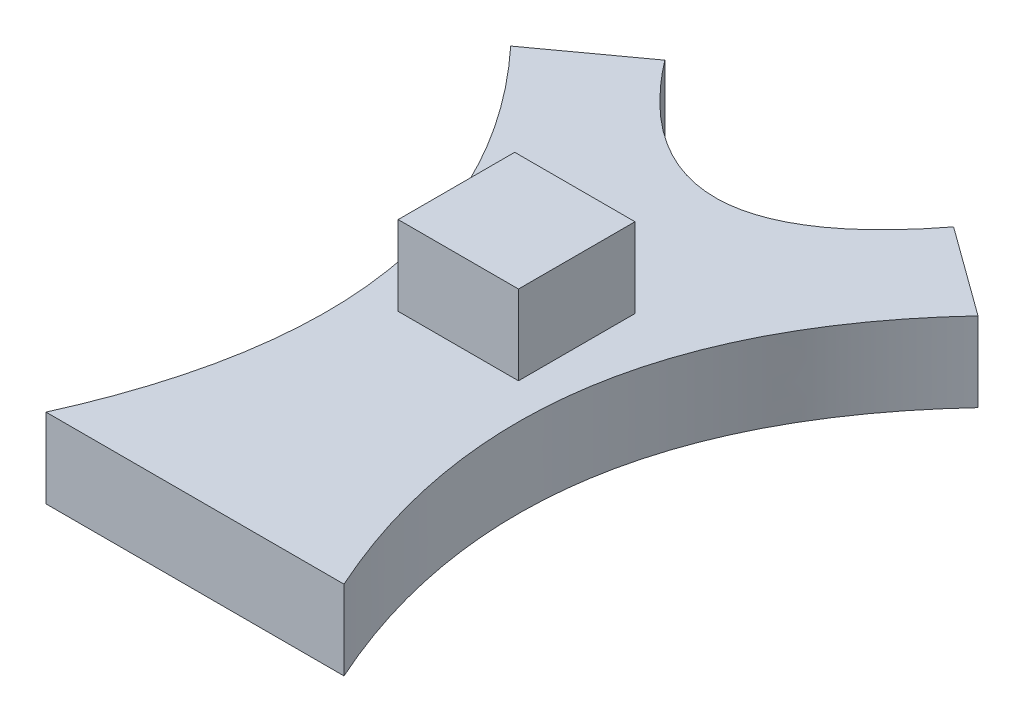
ISO-10303-21;
HEADER;
FILE_DESCRIPTION(('STEP AP214'),'2;1');
FILE_NAME('part.step','',(''),(''),'','','');
FILE_SCHEMA(('AUTOMOTIVE_DESIGN { 1 0 10303 214 1 1 1 1 }'));
ENDSEC;
DATA;
#1=APPLICATION_CONTEXT('core data for automotive mechanical design processes');
#2=APPLICATION_PROTOCOL_DEFINITION('international standard','automotive_design',2000,#1);
#3=PRODUCT_CONTEXT('',#1,'mechanical');
#4=PRODUCT('Part','Part','',(#3));
#5=PRODUCT_RELATED_PRODUCT_CATEGORY('part','',(#4));
#6=PRODUCT_DEFINITION_FORMATION('','',#4);
#7=PRODUCT_DEFINITION_CONTEXT('part definition',#1,'design');
#8=PRODUCT_DEFINITION('design','',#6,#7);
#9=PRODUCT_DEFINITION_SHAPE('','',#8);
#10=(LENGTH_UNIT() NAMED_UNIT(*) SI_UNIT(.MILLI.,.METRE.));
#11=(NAMED_UNIT(*) PLANE_ANGLE_UNIT() SI_UNIT($,.RADIAN.));
#12=(NAMED_UNIT(*) SI_UNIT($,.STERADIAN.) SOLID_ANGLE_UNIT());
#13=UNCERTAINTY_MEASURE_WITH_UNIT(LENGTH_MEASURE(1.E-05),#10,'distance_accuracy_value','');
#14=(GEOMETRIC_REPRESENTATION_CONTEXT(3) GLOBAL_UNCERTAINTY_ASSIGNED_CONTEXT((#13)) GLOBAL_UNIT_ASSIGNED_CONTEXT((#10,
#11,#12)) REPRESENTATION_CONTEXT('',''));
#15=CARTESIAN_POINT('',(0.,0.,0.));
#16=DIRECTION('',(0.,0.,1.));
#17=DIRECTION('',(1.,0.,0.));
#18=AXIS2_PLACEMENT_3D('',#15,#16,#17);
#19=CARTESIAN_POINT('',(-12.6464337295414,10.,3.71814293841253));
#20=DIRECTION('',(0.,1.,0.));
#21=DIRECTION('',(0.,0.,1.));
#22=AXIS2_PLACEMENT_3D('',#19,#20,#21);
#23=PLANE('',#22);
#24=CARTESIAN_POINT('',(-29.3892626146229,10.,-28.6474508437584));
#25=CARTESIAN_POINT('',(-1.22770400923834,10.,1.53458643933057));
#26=CARTESIAN_POINT('',(-18.7410642850661,10.,40.4508497187474));
#27=B_SPLINE_CURVE_WITH_KNOTS('',2,(#24,#25,#26),.UNSPECIFIED.,.F.,.F.,(3,3),(0.,1.),.UNSPECIFIED.);
#28=CARTESIAN_POINT('',(-29.3892626146229,10.,-28.6474508437584));
#29=VERTEX_POINT('',#28);
#30=CARTESIAN_POINT('',(-18.7410642850661,10.,40.4508497187477));
#31=VERTEX_POINT('',#30);
#32=EDGE_CURVE('E157',#29,#31,#27,.T.);
#33=ORIENTED_EDGE('',*,*,#32,.T.);
#34=DIRECTION('',(1.,0.,0.));
#35=VECTOR('',#34,1.);
#36=CARTESIAN_POINT('',(-18.7410642850661,10.,40.4508497187477));
#37=LINE('',#36,#35);
#38=CARTESIAN_POINT('',(18.7410642850661,10.,40.4508497187474));
#39=VERTEX_POINT('',#38);
#40=EDGE_CURVE('E94',#31,#39,#37,.T.);
#41=ORIENTED_EDGE('',*,*,#40,.T.);
#42=CARTESIAN_POINT('',(18.7410642850661,10.,40.4508497187474));
#43=CARTESIAN_POINT('',(1.22770400923834,10.,1.53458643933057));
#44=CARTESIAN_POINT('',(29.3892626146229,10.,-28.6474508437584));
#45=B_SPLINE_CURVE_WITH_KNOTS('',2,(#42,#43,#44),.UNSPECIFIED.,.F.,.F.,(3,3),(0.,1.),.UNSPECIFIED.);
#46=CARTESIAN_POINT('',(29.3892626146235,10.,-28.6474508437578));
#47=VERTEX_POINT('',#46);
#48=EDGE_CURVE('E111',#39,#47,#45,.T.);
#49=ORIENTED_EDGE('',*,*,#48,.T.);
#50=DIRECTION('',(-0.809016994374941,0.,-0.587785252292482));
#51=VECTOR('',#50,1.);
#52=CARTESIAN_POINT('',(18.1635632001347,10.,-36.803398874989));
#53=LINE('',#52,#51);
#54=CARTESIAN_POINT('',(18.1635632001347,10.,-36.803398874989));
#55=VERTEX_POINT('',#54);
#56=EDGE_CURVE('E104',#47,#55,#53,.T.);
#57=ORIENTED_EDGE('',*,*,#56,.T.);
#58=CARTESIAN_POINT('',(18.1635632001347,10.,-36.803398874989));
#59=CARTESIAN_POINT('',(0.,10.,-13.196601125011));
#60=CARTESIAN_POINT('',(-18.1635632001347,10.,-36.803398874989));
#61=B_SPLINE_CURVE_WITH_KNOTS('',2,(#58,#59,#60),.UNSPECIFIED.,.F.,.F.,(3,3),(0.,1.),.UNSPECIFIED.);
#62=CARTESIAN_POINT('',(-18.1635632001347,10.,-36.803398874989));
#63=VERTEX_POINT('',#62);
#64=EDGE_CURVE('E108',#55,#63,#61,.T.);
#65=ORIENTED_EDGE('',*,*,#64,.T.);
#66=DIRECTION('',(-0.809016994374947,0.,0.587785252292473));
#67=VECTOR('',#66,1.);
#68=CARTESIAN_POINT('',(-29.3892626146229,10.,-28.6474508437584));
#69=LINE('',#68,#67);
#70=EDGE_CURVE('E59',#63,#29,#69,.T.);
#71=ORIENTED_EDGE('',*,*,#70,.T.);
#72=EDGE_LOOP('',(#33,#41,#49,#57,#65,#71));
#73=FACE_BOUND('',#72,.T.);
#74=DIRECTION('',(-1.,0.,0.));
#75=VECTOR('',#74,1.);
#76=CARTESIAN_POINT('',(-7.56528732509901,10.,-7.32887277134487));
#77=LINE('',#76,#75);
#78=CARTESIAN_POINT('',(7.56528732509901,10.,-7.32887277134487));
#79=VERTEX_POINT('',#78);
#80=CARTESIAN_POINT('',(-7.56528732509901,10.,-7.32887277134487));
#81=VERTEX_POINT('',#80);
#82=EDGE_CURVE('E182',#79,#81,#77,.T.);
#83=ORIENTED_EDGE('',*,*,#82,.F.);
#84=DIRECTION('',(0.,0.,-1.));
#85=VECTOR('',#84,1.);
#86=CARTESIAN_POINT('',(7.56528732509901,10.,-7.32887277134487));
#87=LINE('',#86,#85);
#88=CARTESIAN_POINT('',(7.56528732509901,10.,7.32887277134487));
#89=VERTEX_POINT('',#88);
#90=EDGE_CURVE('E185',#89,#79,#87,.T.);
#91=ORIENTED_EDGE('',*,*,#90,.F.);
#92=DIRECTION('',(1.,0.,0.));
#93=VECTOR('',#92,1.);
#94=CARTESIAN_POINT('',(-7.56528732509901,10.,7.32887277134487));
#95=LINE('',#94,#93);
#96=CARTESIAN_POINT('',(-7.56528732509901,10.,7.32887277134487));
#97=VERTEX_POINT('',#96);
#98=EDGE_CURVE('E177',#97,#89,#95,.T.);
#99=ORIENTED_EDGE('',*,*,#98,.F.);
#100=DIRECTION('',(0.,0.,1.));
#101=VECTOR('',#100,1.);
#102=CARTESIAN_POINT('',(-7.56528732509901,10.,-7.32887277134487));
#103=LINE('',#102,#101);
#104=EDGE_CURVE('E180',#81,#97,#103,.T.);
#105=ORIENTED_EDGE('',*,*,#104,.F.);
#106=EDGE_LOOP('',(#83,#91,#99,#105));
#107=FACE_BOUND('',#106,.T.);
#108=ADVANCED_FACE('F34',(#73,#107),#23,.T.);
#109=DIRECTION('',(0.,-1.,0.));
#110=VECTOR('',#109,1.);
#111=SURFACE_OF_LINEAR_EXTRUSION('',#27,#110);
#112=CARTESIAN_POINT('',(-29.3892626146229,0.,-28.6474508437584));
#113=CARTESIAN_POINT('',(-1.22770400923834,0.,1.53458643933057));
#114=CARTESIAN_POINT('',(-18.7410642850661,0.,40.4508497187474));
#115=B_SPLINE_CURVE_WITH_KNOTS('',2,(#112,#113,#114),.UNSPECIFIED.,.F.,.F.,(3,3),(0.,1.),.UNSPECIFIED.);
#116=CARTESIAN_POINT('',(-29.3892626146229,0.,-28.6474508437584));
#117=VERTEX_POINT('',#116);
#118=CARTESIAN_POINT('',(-18.7410642850661,0.,40.4508497187477));
#119=VERTEX_POINT('',#118);
#120=EDGE_CURVE('E168',#117,#119,#115,.T.);
#121=ORIENTED_EDGE('',*,*,#120,.T.);
#122=DIRECTION('',(0.,-1.,0.));
#123=VECTOR('',#122,1.);
#124=CARTESIAN_POINT('',(-18.7410642850661,10.,40.4508497187477));
#125=LINE('',#124,#123);
#126=EDGE_CURVE('E11',#31,#119,#125,.T.);
#127=ORIENTED_EDGE('',*,*,#126,.F.);
#128=ORIENTED_EDGE('',*,*,#32,.F.);
#129=DIRECTION('',(0.,-1.,0.));
#130=VECTOR('',#129,1.);
#131=CARTESIAN_POINT('',(-29.3892626146229,10.,-28.6474508437584));
#132=LINE('',#131,#130);
#133=EDGE_CURVE('E128',#29,#117,#132,.T.);
#134=ORIENTED_EDGE('',*,*,#133,.T.);
#135=EDGE_LOOP('',(#121,#127,#128,#134));
#136=FACE_BOUND('',#135,.T.);
#137=ADVANCED_FACE('F36',(#136),#111,.F.);
#138=CARTESIAN_POINT('',(-18.7410642850661,10.,40.4508497187477));
#139=DIRECTION('',(0.,0.,-1.));
#140=DIRECTION('',(-1.,0.,0.));
#141=AXIS2_PLACEMENT_3D('',#138,#139,#140);
#142=PLANE('',#141);
#143=DIRECTION('',(1.,0.,0.));
#144=VECTOR('',#143,1.);
#145=CARTESIAN_POINT('',(-18.7410642850661,0.,40.4508497187477));
#146=LINE('',#145,#144);
#147=CARTESIAN_POINT('',(18.7410642850661,0.,40.4508497187474));
#148=VERTEX_POINT('',#147);
#149=EDGE_CURVE('E244',#119,#148,#146,.T.);
#150=ORIENTED_EDGE('',*,*,#149,.T.);
#151=DIRECTION('',(0.,-1.,0.));
#152=VECTOR('',#151,1.);
#153=CARTESIAN_POINT('',(18.7410642850661,10.,40.4508497187474));
#154=LINE('',#153,#152);
#155=EDGE_CURVE('E43',#39,#148,#154,.T.);
#156=ORIENTED_EDGE('',*,*,#155,.F.);
#157=ORIENTED_EDGE('',*,*,#40,.F.);
#158=ORIENTED_EDGE('',*,*,#126,.T.);
#159=EDGE_LOOP('',(#150,#156,#157,#158));
#160=FACE_BOUND('',#159,.T.);
#161=ADVANCED_FACE('F148',(#160),#142,.F.);
#162=DIRECTION('',(0.,-1.,0.));
#163=VECTOR('',#162,1.);
#164=SURFACE_OF_LINEAR_EXTRUSION('',#45,#163);
#165=CARTESIAN_POINT('',(18.7410642850661,0.,40.4508497187474));
#166=CARTESIAN_POINT('',(1.22770400923834,0.,1.53458643933057));
#167=CARTESIAN_POINT('',(29.3892626146229,0.,-28.6474508437584));
#168=B_SPLINE_CURVE_WITH_KNOTS('',2,(#165,#166,#167),.UNSPECIFIED.,.F.,.F.,(3,3),(0.,1.),.UNSPECIFIED.);
#169=CARTESIAN_POINT('',(29.3892626146235,0.,-28.6474508437578));
#170=VERTEX_POINT('',#169);
#171=EDGE_CURVE('E246',#148,#170,#168,.T.);
#172=ORIENTED_EDGE('',*,*,#171,.T.);
#173=DIRECTION('',(0.,-1.,0.));
#174=VECTOR('',#173,1.);
#175=CARTESIAN_POINT('',(29.3892626146235,10.,-28.6474508437578));
#176=LINE('',#175,#174);
#177=EDGE_CURVE('E123',#47,#170,#176,.T.);
#178=ORIENTED_EDGE('',*,*,#177,.F.);
#179=ORIENTED_EDGE('',*,*,#48,.F.);
#180=ORIENTED_EDGE('',*,*,#155,.T.);
#181=EDGE_LOOP('',(#172,#178,#179,#180));
#182=FACE_BOUND('',#181,.T.);
#183=ADVANCED_FACE('F146',(#182),#164,.F.);
#184=CARTESIAN_POINT('',(18.1635632001347,10.,-36.803398874989));
#185=DIRECTION('',(-0.587785252292482,0.,0.809016994374941));
#186=DIRECTION('',(0.809016994374941,0.,0.587785252292482));
#187=AXIS2_PLACEMENT_3D('',#184,#185,#186);
#188=PLANE('',#187);
#189=DIRECTION('',(-0.809016994374941,0.,-0.587785252292482));
#190=VECTOR('',#189,1.);
#191=CARTESIAN_POINT('',(18.1635632001347,0.,-36.803398874989));
#192=LINE('',#191,#190);
#193=CARTESIAN_POINT('',(18.1635632001347,0.,-36.803398874989));
#194=VERTEX_POINT('',#193);
#195=EDGE_CURVE('E120',#170,#194,#192,.T.);
#196=ORIENTED_EDGE('',*,*,#195,.T.);
#197=DIRECTION('',(0.,-1.,0.));
#198=VECTOR('',#197,1.);
#199=CARTESIAN_POINT('',(18.1635632001347,10.,-36.803398874989));
#200=LINE('',#199,#198);
#201=EDGE_CURVE('E117',#55,#194,#200,.T.);
#202=ORIENTED_EDGE('',*,*,#201,.F.);
#203=ORIENTED_EDGE('',*,*,#56,.F.);
#204=ORIENTED_EDGE('',*,*,#177,.T.);
#205=EDGE_LOOP('',(#196,#202,#203,#204));
#206=FACE_BOUND('',#205,.T.);
#207=ADVANCED_FACE('F118',(#206),#188,.F.);
#208=DIRECTION('',(0.,-1.,0.));
#209=VECTOR('',#208,1.);
#210=SURFACE_OF_LINEAR_EXTRUSION('',#61,#209);
#211=CARTESIAN_POINT('',(18.1635632001347,0.,-36.803398874989));
#212=CARTESIAN_POINT('',(0.,0.,-13.196601125011));
#213=CARTESIAN_POINT('',(-18.1635632001347,0.,-36.803398874989));
#214=B_SPLINE_CURVE_WITH_KNOTS('',2,(#211,#212,#213),.UNSPECIFIED.,.F.,.F.,(3,3),(0.,1.),.UNSPECIFIED.);
#215=CARTESIAN_POINT('',(-18.1635632001347,0.,-36.803398874989));
#216=VERTEX_POINT('',#215);
#217=EDGE_CURVE('E261',#194,#216,#214,.T.);
#218=ORIENTED_EDGE('',*,*,#217,.T.);
#219=DIRECTION('',(0.,-1.,0.));
#220=VECTOR('',#219,1.);
#221=CARTESIAN_POINT('',(-18.1635632001347,10.,-36.803398874989));
#222=LINE('',#221,#220);
#223=EDGE_CURVE('E124',#63,#216,#222,.T.);
#224=ORIENTED_EDGE('',*,*,#223,.F.);
#225=ORIENTED_EDGE('',*,*,#64,.F.);
#226=ORIENTED_EDGE('',*,*,#201,.T.);
#227=EDGE_LOOP('',(#218,#224,#225,#226));
#228=FACE_BOUND('',#227,.T.);
#229=ADVANCED_FACE('F126',(#228),#210,.F.);
#230=CARTESIAN_POINT('',(-29.3892626146229,10.,-28.6474508437584));
#231=DIRECTION('',(0.587785252292473,0.,0.809016994374947));
#232=DIRECTION('',(0.809016994374948,0.,-0.587785252292473));
#233=AXIS2_PLACEMENT_3D('',#230,#231,#232);
#234=PLANE('',#233);
#235=DIRECTION('',(-0.809016994374947,0.,0.587785252292473));
#236=VECTOR('',#235,1.);
#237=CARTESIAN_POINT('',(-29.3892626146229,0.,-28.6474508437584));
#238=LINE('',#237,#236);
#239=EDGE_CURVE('E86',#216,#117,#238,.T.);
#240=ORIENTED_EDGE('',*,*,#239,.T.);
#241=ORIENTED_EDGE('',*,*,#133,.F.);
#242=ORIENTED_EDGE('',*,*,#70,.F.);
#243=ORIENTED_EDGE('',*,*,#223,.T.);
#244=EDGE_LOOP('',(#240,#241,#242,#243));
#245=FACE_BOUND('',#244,.T.);
#246=ADVANCED_FACE('F142',(#245),#234,.F.);
#247=CARTESIAN_POINT('',(-12.6464337295414,0.,3.71814293841253));
#248=DIRECTION('',(0.,1.,0.));
#249=DIRECTION('',(0.,0.,1.));
#250=AXIS2_PLACEMENT_3D('',#247,#248,#249);
#251=PLANE('',#250);
#252=ORIENTED_EDGE('',*,*,#120,.F.);
#253=ORIENTED_EDGE('',*,*,#239,.F.);
#254=ORIENTED_EDGE('',*,*,#217,.F.);
#255=ORIENTED_EDGE('',*,*,#195,.F.);
#256=ORIENTED_EDGE('',*,*,#171,.F.);
#257=ORIENTED_EDGE('',*,*,#149,.F.);
#258=EDGE_LOOP('',(#252,#253,#254,#255,#256,#257));
#259=FACE_BOUND('',#258,.T.);
#260=ADVANCED_FACE('F234',(#259),#251,.F.);
#261=CARTESIAN_POINT('',(7.56528732509901,20.,-7.32887277134487));
#262=DIRECTION('',(-1.,0.,0.));
#263=DIRECTION('',(0.,0.,1.));
#264=AXIS2_PLACEMENT_3D('',#261,#262,#263);
#265=PLANE('',#264);
#266=ORIENTED_EDGE('',*,*,#90,.T.);
#267=DIRECTION('',(0.,-1.,0.));
#268=VECTOR('',#267,1.);
#269=CARTESIAN_POINT('',(7.56528732509901,20.,-7.32887277134487));
#270=LINE('',#269,#268);
#271=CARTESIAN_POINT('',(7.56528732509901,20.,-7.32887277134487));
#272=VERTEX_POINT('',#271);
#273=EDGE_CURVE('E162',#272,#79,#270,.T.);
#274=ORIENTED_EDGE('',*,*,#273,.F.);
#275=DIRECTION('',(0.,0.,-1.));
#276=VECTOR('',#275,1.);
#277=CARTESIAN_POINT('',(7.56528732509901,20.,-7.32887277134487));
#278=LINE('',#277,#276);
#279=CARTESIAN_POINT('',(7.56528732509901,20.,7.32887277134487));
#280=VERTEX_POINT('',#279);
#281=EDGE_CURVE('E179',#280,#272,#278,.T.);
#282=ORIENTED_EDGE('',*,*,#281,.F.);
#283=DIRECTION('',(0.,-1.,0.));
#284=VECTOR('',#283,1.);
#285=CARTESIAN_POINT('',(7.56528732509901,20.,7.32887277134487));
#286=LINE('',#285,#284);
#287=EDGE_CURVE('E173',#280,#89,#286,.T.);
#288=ORIENTED_EDGE('',*,*,#287,.T.);
#289=EDGE_LOOP('',(#266,#274,#282,#288));
#290=FACE_BOUND('',#289,.T.);
#291=ADVANCED_FACE('F208',(#290),#265,.F.);
#292=CARTESIAN_POINT('',(-7.56528732509901,20.,-7.32887277134487));
#293=DIRECTION('',(0.,0.,1.));
#294=DIRECTION('',(1.,0.,0.));
#295=AXIS2_PLACEMENT_3D('',#292,#293,#294);
#296=PLANE('',#295);
#297=ORIENTED_EDGE('',*,*,#82,.T.);
#298=DIRECTION('',(0.,-1.,0.));
#299=VECTOR('',#298,1.);
#300=CARTESIAN_POINT('',(-7.56528732509901,20.,-7.32887277134487));
#301=LINE('',#300,#299);
#302=CARTESIAN_POINT('',(-7.56528732509901,20.,-7.32887277134487));
#303=VERTEX_POINT('',#302);
#304=EDGE_CURVE('E169',#303,#81,#301,.T.);
#305=ORIENTED_EDGE('',*,*,#304,.F.);
#306=DIRECTION('',(-1.,0.,0.));
#307=VECTOR('',#306,1.);
#308=CARTESIAN_POINT('',(-7.56528732509901,20.,-7.32887277134487));
#309=LINE('',#308,#307);
#310=EDGE_CURVE('E193',#272,#303,#309,.T.);
#311=ORIENTED_EDGE('',*,*,#310,.F.);
#312=ORIENTED_EDGE('',*,*,#273,.T.);
#313=EDGE_LOOP('',(#297,#305,#311,#312));
#314=FACE_BOUND('',#313,.T.);
#315=ADVANCED_FACE('F213',(#314),#296,.F.);
#316=CARTESIAN_POINT('',(-7.56528732509901,20.,-7.32887277134487));
#317=DIRECTION('',(1.,0.,0.));
#318=DIRECTION('',(0.,0.,-1.));
#319=AXIS2_PLACEMENT_3D('',#316,#317,#318);
#320=PLANE('',#319);
#321=ORIENTED_EDGE('',*,*,#104,.T.);
#322=DIRECTION('',(0.,-1.,0.));
#323=VECTOR('',#322,1.);
#324=CARTESIAN_POINT('',(-7.56528732509901,20.,7.32887277134487));
#325=LINE('',#324,#323);
#326=CARTESIAN_POINT('',(-7.56528732509901,20.,7.32887277134487));
#327=VERTEX_POINT('',#326);
#328=EDGE_CURVE('E50',#327,#97,#325,.T.);
#329=ORIENTED_EDGE('',*,*,#328,.F.);
#330=DIRECTION('',(0.,0.,1.));
#331=VECTOR('',#330,1.);
#332=CARTESIAN_POINT('',(-7.56528732509901,20.,-7.32887277134487));
#333=LINE('',#332,#331);
#334=EDGE_CURVE('E190',#303,#327,#333,.T.);
#335=ORIENTED_EDGE('',*,*,#334,.F.);
#336=ORIENTED_EDGE('',*,*,#304,.T.);
#337=EDGE_LOOP('',(#321,#329,#335,#336));
#338=FACE_BOUND('',#337,.T.);
#339=ADVANCED_FACE('F222',(#338),#320,.F.);
#340=CARTESIAN_POINT('',(-7.56528732509901,20.,7.32887277134487));
#341=DIRECTION('',(0.,0.,-1.));
#342=DIRECTION('',(-1.,0.,0.));
#343=AXIS2_PLACEMENT_3D('',#340,#341,#342);
#344=PLANE('',#343);
#345=ORIENTED_EDGE('',*,*,#98,.T.);
#346=ORIENTED_EDGE('',*,*,#287,.F.);
#347=DIRECTION('',(1.,0.,0.));
#348=VECTOR('',#347,1.);
#349=CARTESIAN_POINT('',(-7.56528732509901,20.,7.32887277134487));
#350=LINE('',#349,#348);
#351=EDGE_CURVE('E176',#327,#280,#350,.T.);
#352=ORIENTED_EDGE('',*,*,#351,.F.);
#353=ORIENTED_EDGE('',*,*,#328,.T.);
#354=EDGE_LOOP('',(#345,#346,#352,#353));
#355=FACE_BOUND('',#354,.T.);
#356=ADVANCED_FACE('F225',(#355),#344,.F.);
#357=CARTESIAN_POINT('',(0.,20.,0.));
#358=DIRECTION('',(0.,1.,0.));
#359=DIRECTION('',(0.,0.,1.));
#360=AXIS2_PLACEMENT_3D('',#357,#358,#359);
#361=PLANE('',#360);
#362=ORIENTED_EDGE('',*,*,#281,.T.);
#363=ORIENTED_EDGE('',*,*,#310,.T.);
#364=ORIENTED_EDGE('',*,*,#334,.T.);
#365=ORIENTED_EDGE('',*,*,#351,.T.);
#366=EDGE_LOOP('',(#362,#363,#364,#365));
#367=FACE_BOUND('',#366,.T.);
#368=ADVANCED_FACE('F201',(#367),#361,.T.);
#369=CLOSED_SHELL('',(#108,#137,#161,#183,#207,#229,#246,#260,#291,#315,#339,#356,#368));
#370=MANIFOLD_SOLID_BREP('B2',#369);
#371=ADVANCED_BREP_SHAPE_REPRESENTATION('',(#18,#370),#14);
#372=SHAPE_DEFINITION_REPRESENTATION(#9,#371);
ENDSEC;
END-ISO-10303-21;
